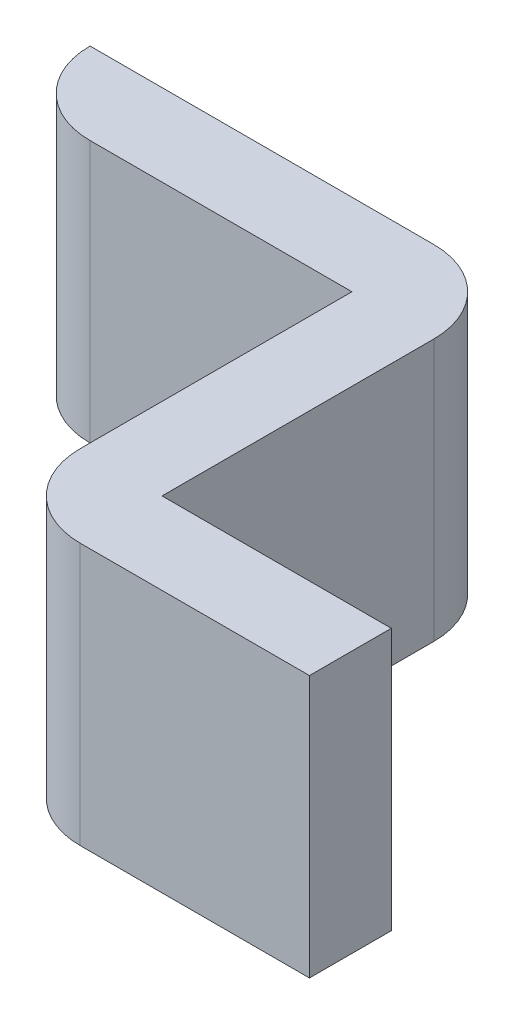
ISO-10303-21;
HEADER;
FILE_DESCRIPTION(('STEP AP214'),'2;1');
FILE_NAME('part.step','',(''),(''),'','','');
FILE_SCHEMA(('AUTOMOTIVE_DESIGN { 1 0 10303 214 1 1 1 1 }'));
ENDSEC;
DATA;
#1=APPLICATION_CONTEXT('core data for automotive mechanical design processes');
#2=APPLICATION_PROTOCOL_DEFINITION('international standard','automotive_design',2000,#1);
#3=PRODUCT_CONTEXT('',#1,'mechanical');
#4=PRODUCT('Part','Part','',(#3));
#5=PRODUCT_RELATED_PRODUCT_CATEGORY('part','',(#4));
#6=PRODUCT_DEFINITION_FORMATION('','',#4);
#7=PRODUCT_DEFINITION_CONTEXT('part definition',#1,'design');
#8=PRODUCT_DEFINITION('design','',#6,#7);
#9=PRODUCT_DEFINITION_SHAPE('','',#8);
#10=(LENGTH_UNIT() NAMED_UNIT(*) SI_UNIT(.MILLI.,.METRE.));
#11=(NAMED_UNIT(*) PLANE_ANGLE_UNIT() SI_UNIT($,.RADIAN.));
#12=(NAMED_UNIT(*) SI_UNIT($,.STERADIAN.) SOLID_ANGLE_UNIT());
#13=UNCERTAINTY_MEASURE_WITH_UNIT(LENGTH_MEASURE(1.E-05),#10,'distance_accuracy_value','');
#14=(GEOMETRIC_REPRESENTATION_CONTEXT(3) GLOBAL_UNCERTAINTY_ASSIGNED_CONTEXT((#13)) GLOBAL_UNIT_ASSIGNED_CONTEXT((#10,
#11,#12)) REPRESENTATION_CONTEXT('',''));
#15=CARTESIAN_POINT('',(0.,0.,0.));
#16=DIRECTION('',(0.,0.,1.));
#17=DIRECTION('',(1.,0.,0.));
#18=AXIS2_PLACEMENT_3D('',#15,#16,#17);
#19=CARTESIAN_POINT('',(7.525,-0.37022,1.08));
#20=DIRECTION('',(-1.,0.,0.));
#21=DIRECTION('',(0.,0.,1.));
#22=AXIS2_PLACEMENT_3D('',#19,#20,#21);
#23=PLANE('',#22);
#24=DIRECTION('',(0.,-1.,0.));
#25=VECTOR('',#24,1.);
#26=CARTESIAN_POINT('',(7.525,-0.37022,0.25));
#27=LINE('',#26,#25);
#28=CARTESIAN_POINT('',(7.525,0.42978,0.25));
#29=VERTEX_POINT('',#28);
#30=CARTESIAN_POINT('',(7.525,-0.37022,0.25));
#31=VERTEX_POINT('',#30);
#32=EDGE_CURVE('E83',#29,#31,#27,.T.);
#33=ORIENTED_EDGE('',*,*,#32,.F.);
#34=DIRECTION('',(0.,0.,-1.));
#35=VECTOR('',#34,1.);
#36=CARTESIAN_POINT('',(7.525,0.42978,0.));
#37=LINE('',#36,#35);
#38=CARTESIAN_POINT('',(7.525,0.42978,1.08));
#39=VERTEX_POINT('',#38);
#40=EDGE_CURVE('E80',#29,#39,#37,.F.);
#41=ORIENTED_EDGE('',*,*,#40,.T.);
#42=DIRECTION('',(0.,1.,0.));
#43=VECTOR('',#42,1.);
#44=CARTESIAN_POINT('',(7.525,-0.37022,1.08));
#45=LINE('',#44,#43);
#46=CARTESIAN_POINT('',(7.525,-0.37022,1.08));
#47=VERTEX_POINT('',#46);
#48=EDGE_CURVE('E148',#39,#47,#45,.F.);
#49=ORIENTED_EDGE('',*,*,#48,.T.);
#50=DIRECTION('',(0.,0.,-1.));
#51=VECTOR('',#50,1.);
#52=CARTESIAN_POINT('',(7.525,-0.37022,0.));
#53=LINE('',#52,#51);
#54=EDGE_CURVE('E153',#31,#47,#53,.F.);
#55=ORIENTED_EDGE('',*,*,#54,.F.);
#56=EDGE_LOOP('',(#33,#41,#49,#55));
#57=FACE_BOUND('',#56,.T.);
#58=ADVANCED_FACE('F17',(#57),#23,.F.);
#59=CARTESIAN_POINT('',(8.22522,-0.37022,1.08));
#60=DIRECTION('',(0.,0.,1.));
#61=DIRECTION('',(1.,0.,0.));
#62=AXIS2_PLACEMENT_3D('',#59,#60,#61);
#63=PLANE('',#62);
#64=ORIENTED_EDGE('',*,*,#48,.F.);
#65=DIRECTION('',(1.,0.,0.));
#66=VECTOR('',#65,1.);
#67=CARTESIAN_POINT('',(6.225,0.42978,1.08));
#68=LINE('',#67,#66);
#69=CARTESIAN_POINT('',(8.22522,0.42978,1.08));
#70=VERTEX_POINT('',#69);
#71=EDGE_CURVE('E118',#39,#70,#68,.T.);
#72=ORIENTED_EDGE('',*,*,#71,.T.);
#73=DIRECTION('',(0.,1.,0.));
#74=VECTOR('',#73,1.);
#75=CARTESIAN_POINT('',(8.22522,-0.37022,1.08));
#76=LINE('',#75,#74);
#77=CARTESIAN_POINT('',(8.22522,-0.37022,1.08));
#78=VERTEX_POINT('',#77);
#79=EDGE_CURVE('E136',#70,#78,#76,.F.);
#80=ORIENTED_EDGE('',*,*,#79,.T.);
#81=DIRECTION('',(1.,0.,0.));
#82=VECTOR('',#81,1.);
#83=CARTESIAN_POINT('',(6.225,-0.37022,1.08));
#84=LINE('',#83,#82);
#85=EDGE_CURVE('E143',#47,#78,#84,.T.);
#86=ORIENTED_EDGE('',*,*,#85,.F.);
#87=EDGE_LOOP('',(#64,#72,#80,#86));
#88=FACE_BOUND('',#87,.T.);
#89=ADVANCED_FACE('F315',(#88),#63,.F.);
#90=CARTESIAN_POINT('',(8.22522,-0.37022,1.33));
#91=DIRECTION('',(-1.,0.,0.));
#92=DIRECTION('',(0.,0.,1.));
#93=AXIS2_PLACEMENT_3D('',#90,#91,#92);
#94=PLANE('',#93);
#95=ORIENTED_EDGE('',*,*,#79,.F.);
#96=DIRECTION('',(0.,0.,-1.));
#97=VECTOR('',#96,1.);
#98=CARTESIAN_POINT('',(8.22522,0.42978,0.));
#99=LINE('',#98,#97);
#100=CARTESIAN_POINT('',(8.22522,0.42978,1.33));
#101=VERTEX_POINT('',#100);
#102=EDGE_CURVE('E114',#70,#101,#99,.F.);
#103=ORIENTED_EDGE('',*,*,#102,.T.);
#104=DIRECTION('',(0.,1.,0.));
#105=VECTOR('',#104,1.);
#106=CARTESIAN_POINT('',(8.22522,-0.37022,1.33));
#107=LINE('',#106,#105);
#108=CARTESIAN_POINT('',(8.22522,-0.37022,1.33));
#109=VERTEX_POINT('',#108);
#110=EDGE_CURVE('E133',#101,#109,#107,.F.);
#111=ORIENTED_EDGE('',*,*,#110,.T.);
#112=DIRECTION('',(0.,0.,-1.));
#113=VECTOR('',#112,1.);
#114=CARTESIAN_POINT('',(8.22522,-0.37022,0.));
#115=LINE('',#114,#113);
#116=EDGE_CURVE('E139',#78,#109,#115,.F.);
#117=ORIENTED_EDGE('',*,*,#116,.F.);
#118=EDGE_LOOP('',(#95,#103,#111,#117));
#119=FACE_BOUND('',#118,.T.);
#120=ADVANCED_FACE('F192',(#119),#94,.F.);
#121=CARTESIAN_POINT('',(7.525,-0.37022,1.33));
#122=DIRECTION('',(0.,0.,-1.));
#123=DIRECTION('',(-1.,0.,0.));
#124=AXIS2_PLACEMENT_3D('',#121,#122,#123);
#125=PLANE('',#124);
#126=ORIENTED_EDGE('',*,*,#110,.F.);
#127=DIRECTION('',(1.,0.,0.));
#128=VECTOR('',#127,1.);
#129=CARTESIAN_POINT('',(6.225,0.42978,1.33));
#130=LINE('',#129,#128);
#131=CARTESIAN_POINT('',(7.525,0.42978,1.33));
#132=VERTEX_POINT('',#131);
#133=EDGE_CURVE('E111',#101,#132,#130,.F.);
#134=ORIENTED_EDGE('',*,*,#133,.T.);
#135=DIRECTION('',(0.,-1.,0.));
#136=VECTOR('',#135,1.);
#137=CARTESIAN_POINT('',(7.525,-0.37022,1.33));
#138=LINE('',#137,#136);
#139=CARTESIAN_POINT('',(7.525,-0.37022,1.33));
#140=VERTEX_POINT('',#139);
#141=EDGE_CURVE('E131',#140,#132,#138,.F.);
#142=ORIENTED_EDGE('',*,*,#141,.F.);
#143=DIRECTION('',(1.,0.,0.));
#144=VECTOR('',#143,1.);
#145=CARTESIAN_POINT('',(6.225,-0.37022,1.33));
#146=LINE('',#145,#144);
#147=EDGE_CURVE('E142',#109,#140,#146,.F.);
#148=ORIENTED_EDGE('',*,*,#147,.F.);
#149=EDGE_LOOP('',(#126,#134,#142,#148));
#150=FACE_BOUND('',#149,.T.);
#151=ADVANCED_FACE('F185',(#150),#125,.F.);
#152=CARTESIAN_POINT('',(7.525,-0.37022,1.08));
#153=DIRECTION('',(0.,-1.,0.));
#154=DIRECTION('',(0.,0.,-1.));
#155=AXIS2_PLACEMENT_3D('',#152,#153,#154);
#156=CYLINDRICAL_SURFACE('',#155,0.25);
#157=CARTESIAN_POINT('',(7.525,0.42978,1.08));
#158=DIRECTION('',(0.,-1.,0.));
#159=DIRECTION('',(0.,0.,-1.));
#160=AXIS2_PLACEMENT_3D('',#157,#158,#159);
#161=CIRCLE('',#160,0.25);
#162=CARTESIAN_POINT('',(7.275,0.42978,1.08));
#163=VERTEX_POINT('',#162);
#164=EDGE_CURVE('E108',#132,#163,#161,.T.);
#165=ORIENTED_EDGE('',*,*,#164,.T.);
#166=DIRECTION('',(0.,1.,0.));
#167=VECTOR('',#166,1.);
#168=CARTESIAN_POINT('',(7.275,-0.37022,1.08));
#169=LINE('',#168,#167);
#170=CARTESIAN_POINT('',(7.275,-0.37022,1.08));
#171=VERTEX_POINT('',#170);
#172=EDGE_CURVE('E126',#163,#171,#169,.F.);
#173=ORIENTED_EDGE('',*,*,#172,.T.);
#174=CARTESIAN_POINT('',(7.525,-0.37022,1.08));
#175=DIRECTION('',(0.,-1.,0.));
#176=DIRECTION('',(0.,0.,-1.));
#177=AXIS2_PLACEMENT_3D('',#174,#175,#176);
#178=CIRCLE('',#177,0.25);
#179=EDGE_CURVE('E169',#140,#171,#178,.T.);
#180=ORIENTED_EDGE('',*,*,#179,.F.);
#181=ORIENTED_EDGE('',*,*,#141,.T.);
#182=EDGE_LOOP('',(#165,#173,#180,#181));
#183=FACE_BOUND('',#182,.T.);
#184=ADVANCED_FACE('F176',(#183),#156,.T.);
#185=CARTESIAN_POINT('',(7.275,-0.37022,0.25));
#186=DIRECTION('',(1.,0.,0.));
#187=DIRECTION('',(0.,0.,-1.));
#188=AXIS2_PLACEMENT_3D('',#185,#186,#187);
#189=PLANE('',#188);
#190=ORIENTED_EDGE('',*,*,#172,.F.);
#191=DIRECTION('',(0.,0.,-1.));
#192=VECTOR('',#191,1.);
#193=CARTESIAN_POINT('',(7.275,0.42978,0.));
#194=LINE('',#193,#192);
#195=CARTESIAN_POINT('',(7.275,0.42978,0.25));
#196=VERTEX_POINT('',#195);
#197=EDGE_CURVE('E103',#163,#196,#194,.T.);
#198=ORIENTED_EDGE('',*,*,#197,.T.);
#199=DIRECTION('',(0.,1.,0.));
#200=VECTOR('',#199,1.);
#201=CARTESIAN_POINT('',(7.275,-0.37022,0.25));
#202=LINE('',#201,#200);
#203=CARTESIAN_POINT('',(7.275,-0.37022,0.25));
#204=VERTEX_POINT('',#203);
#205=EDGE_CURVE('E123',#196,#204,#202,.F.);
#206=ORIENTED_EDGE('',*,*,#205,.T.);
#207=DIRECTION('',(0.,0.,-1.));
#208=VECTOR('',#207,1.);
#209=CARTESIAN_POINT('',(7.275,-0.37022,0.));
#210=LINE('',#209,#208);
#211=EDGE_CURVE('E171',#171,#204,#210,.T.);
#212=ORIENTED_EDGE('',*,*,#211,.F.);
#213=EDGE_LOOP('',(#190,#198,#206,#212));
#214=FACE_BOUND('',#213,.T.);
#215=ADVANCED_FACE('F230',(#214),#189,.F.);
#216=CARTESIAN_POINT('',(6.475,-0.37022,0.25));
#217=DIRECTION('',(0.,0.,-1.));
#218=DIRECTION('',(-1.,0.,0.));
#219=AXIS2_PLACEMENT_3D('',#216,#217,#218);
#220=PLANE('',#219);
#221=ORIENTED_EDGE('',*,*,#205,.F.);
#222=DIRECTION('',(1.,0.,0.));
#223=VECTOR('',#222,1.);
#224=CARTESIAN_POINT('',(6.225,0.42978,0.25));
#225=LINE('',#224,#223);
#226=CARTESIAN_POINT('',(6.475,0.42978,0.25));
#227=VERTEX_POINT('',#226);
#228=EDGE_CURVE('E99',#196,#227,#225,.F.);
#229=ORIENTED_EDGE('',*,*,#228,.T.);
#230=DIRECTION('',(0.,-1.,0.));
#231=VECTOR('',#230,1.);
#232=CARTESIAN_POINT('',(6.475,-0.37022,0.25));
#233=LINE('',#232,#231);
#234=CARTESIAN_POINT('',(6.475,-0.37022,0.25));
#235=VERTEX_POINT('',#234);
#236=EDGE_CURVE('E102',#235,#227,#233,.F.);
#237=ORIENTED_EDGE('',*,*,#236,.F.);
#238=DIRECTION('',(1.,0.,0.));
#239=VECTOR('',#238,1.);
#240=CARTESIAN_POINT('',(6.225,-0.37022,0.25));
#241=LINE('',#240,#239);
#242=EDGE_CURVE('E95',#204,#235,#241,.F.);
#243=ORIENTED_EDGE('',*,*,#242,.F.);
#244=EDGE_LOOP('',(#221,#229,#237,#243));
#245=FACE_BOUND('',#244,.T.);
#246=ADVANCED_FACE('F228',(#245),#220,.F.);
#247=CARTESIAN_POINT('',(7.275,-0.37022,0.25));
#248=DIRECTION('',(0.,-1.,0.));
#249=DIRECTION('',(0.,0.,-1.));
#250=AXIS2_PLACEMENT_3D('',#247,#248,#249);
#251=CYLINDRICAL_SURFACE('',#250,0.25);
#252=CARTESIAN_POINT('',(7.275,0.42978,0.25));
#253=DIRECTION('',(0.,-1.,0.));
#254=DIRECTION('',(0.,0.,-1.));
#255=AXIS2_PLACEMENT_3D('',#252,#253,#254);
#256=CIRCLE('',#255,0.25);
#257=CARTESIAN_POINT('',(7.275,0.42978,0.));
#258=VERTEX_POINT('',#257);
#259=EDGE_CURVE('E20',#258,#29,#256,.T.);
#260=ORIENTED_EDGE('',*,*,#259,.T.);
#261=ORIENTED_EDGE('',*,*,#32,.T.);
#262=CARTESIAN_POINT('',(7.275,-0.37022,0.25));
#263=DIRECTION('',(0.,-1.,0.));
#264=DIRECTION('',(0.,0.,-1.));
#265=AXIS2_PLACEMENT_3D('',#262,#263,#264);
#266=CIRCLE('',#265,0.25);
#267=CARTESIAN_POINT('',(7.275,-0.37022,0.));
#268=VERTEX_POINT('',#267);
#269=EDGE_CURVE('E93',#268,#31,#266,.T.);
#270=ORIENTED_EDGE('',*,*,#269,.F.);
#271=DIRECTION('',(0.,1.,0.));
#272=VECTOR('',#271,1.);
#273=CARTESIAN_POINT('',(7.275,-0.37022,0.));
#274=LINE('',#273,#272);
#275=EDGE_CURVE('E87',#268,#258,#274,.T.);
#276=ORIENTED_EDGE('',*,*,#275,.T.);
#277=EDGE_LOOP('',(#260,#261,#270,#276));
#278=FACE_BOUND('',#277,.T.);
#279=ADVANCED_FACE('F91',(#278),#251,.T.);
#280=CARTESIAN_POINT('',(6.225,0.42978,0.));
#281=DIRECTION('',(0.,-1.,0.));
#282=DIRECTION('',(0.,0.,-1.));
#283=AXIS2_PLACEMENT_3D('',#280,#281,#282);
#284=PLANE('',#283);
#285=ORIENTED_EDGE('',*,*,#228,.F.);
#286=ORIENTED_EDGE('',*,*,#197,.F.);
#287=ORIENTED_EDGE('',*,*,#164,.F.);
#288=ORIENTED_EDGE('',*,*,#133,.F.);
#289=ORIENTED_EDGE('',*,*,#102,.F.);
#290=ORIENTED_EDGE('',*,*,#71,.F.);
#291=ORIENTED_EDGE('',*,*,#40,.F.);
#292=ORIENTED_EDGE('',*,*,#259,.F.);
#293=DIRECTION('',(1.,0.,0.));
#294=VECTOR('',#293,1.);
#295=CARTESIAN_POINT('',(7.275,0.42978,0.));
#296=LINE('',#295,#294);
#297=CARTESIAN_POINT('',(6.225,0.42978,0.));
#298=VERTEX_POINT('',#297);
#299=EDGE_CURVE('E77',#258,#298,#296,.F.);
#300=ORIENTED_EDGE('',*,*,#299,.T.);
#301=CARTESIAN_POINT('',(6.475,0.42978,0.));
#302=DIRECTION('',(0.,-1.,0.));
#303=DIRECTION('',(0.,0.,-1.));
#304=AXIS2_PLACEMENT_3D('',#301,#302,#303);
#305=CIRCLE('',#304,0.25);
#306=EDGE_CURVE('E122',#227,#298,#305,.T.);
#307=ORIENTED_EDGE('',*,*,#306,.F.);
#308=EDGE_LOOP('',(#285,#286,#287,#288,#289,#290,#291,#292,#300,#307));
#309=FACE_BOUND('',#308,.T.);
#310=ADVANCED_FACE('F75',(#309),#284,.F.);
#311=CARTESIAN_POINT('',(6.475,-0.37022,0.));
#312=DIRECTION('',(0.,-1.,0.));
#313=DIRECTION('',(0.,0.,-1.));
#314=AXIS2_PLACEMENT_3D('',#311,#312,#313);
#315=CYLINDRICAL_SURFACE('',#314,0.25);
#316=ORIENTED_EDGE('',*,*,#306,.T.);
#317=DIRECTION('',(0.,1.,0.));
#318=VECTOR('',#317,1.);
#319=CARTESIAN_POINT('',(6.225,-0.37022,0.));
#320=LINE('',#319,#318);
#321=CARTESIAN_POINT('',(6.225,-0.37022,0.));
#322=VERTEX_POINT('',#321);
#323=EDGE_CURVE('E26',#298,#322,#320,.F.);
#324=ORIENTED_EDGE('',*,*,#323,.T.);
#325=CARTESIAN_POINT('',(6.475,-0.37022,0.));
#326=DIRECTION('',(0.,-1.,0.));
#327=DIRECTION('',(0.,0.,-1.));
#328=AXIS2_PLACEMENT_3D('',#325,#326,#327);
#329=CIRCLE('',#328,0.25);
#330=EDGE_CURVE('E34',#235,#322,#329,.T.);
#331=ORIENTED_EDGE('',*,*,#330,.F.);
#332=ORIENTED_EDGE('',*,*,#236,.T.);
#333=EDGE_LOOP('',(#316,#324,#331,#332));
#334=FACE_BOUND('',#333,.T.);
#335=ADVANCED_FACE('F210',(#334),#315,.T.);
#336=CARTESIAN_POINT('',(6.225,-0.37022,0.));
#337=DIRECTION('',(0.,-1.,0.));
#338=DIRECTION('',(0.,0.,-1.));
#339=AXIS2_PLACEMENT_3D('',#336,#337,#338);
#340=PLANE('',#339);
#341=ORIENTED_EDGE('',*,*,#242,.T.);
#342=ORIENTED_EDGE('',*,*,#330,.T.);
#343=DIRECTION('',(1.,0.,0.));
#344=VECTOR('',#343,1.);
#345=CARTESIAN_POINT('',(7.275,-0.37022,0.));
#346=LINE('',#345,#344);
#347=EDGE_CURVE('E11',#322,#268,#346,.T.);
#348=ORIENTED_EDGE('',*,*,#347,.T.);
#349=ORIENTED_EDGE('',*,*,#269,.T.);
#350=ORIENTED_EDGE('',*,*,#54,.T.);
#351=ORIENTED_EDGE('',*,*,#85,.T.);
#352=ORIENTED_EDGE('',*,*,#116,.T.);
#353=ORIENTED_EDGE('',*,*,#147,.T.);
#354=ORIENTED_EDGE('',*,*,#179,.T.);
#355=ORIENTED_EDGE('',*,*,#211,.T.);
#356=EDGE_LOOP('',(#341,#342,#348,#349,#350,#351,#352,#353,#354,#355));
#357=FACE_BOUND('',#356,.T.);
#358=ADVANCED_FACE('F208',(#357),#340,.T.);
#359=CARTESIAN_POINT('',(7.275,-0.37022,0.));
#360=DIRECTION('',(0.,0.,1.));
#361=DIRECTION('',(1.,0.,0.));
#362=AXIS2_PLACEMENT_3D('',#359,#360,#361);
#363=PLANE('',#362);
#364=ORIENTED_EDGE('',*,*,#323,.F.);
#365=ORIENTED_EDGE('',*,*,#299,.F.);
#366=ORIENTED_EDGE('',*,*,#275,.F.);
#367=ORIENTED_EDGE('',*,*,#347,.F.);
#368=EDGE_LOOP('',(#364,#365,#366,#367));
#369=FACE_BOUND('',#368,.T.);
#370=ADVANCED_FACE('F86',(#369),#363,.F.);
#371=CLOSED_SHELL('',(#58,#89,#120,#151,#184,#215,#246,#279,#310,#335,#358,#370));
#372=MANIFOLD_SOLID_BREP('B1',#371);
#373=ADVANCED_BREP_SHAPE_REPRESENTATION('',(#18,#372),#14);
#374=SHAPE_DEFINITION_REPRESENTATION(#9,#373);
ENDSEC;
END-ISO-10303-21;
